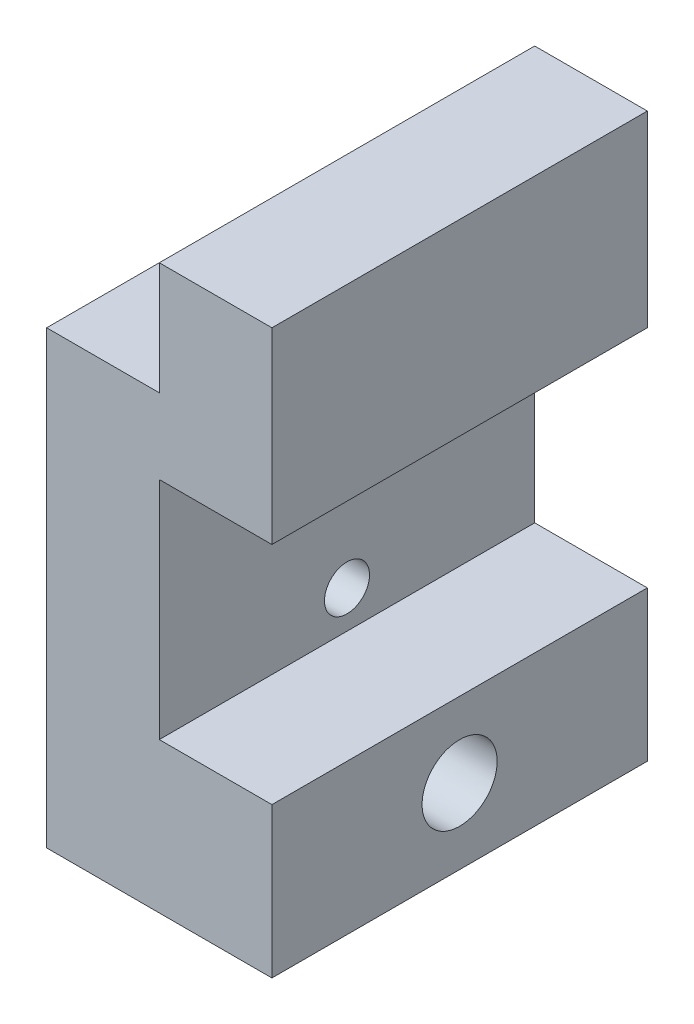
ISO-10303-21;
HEADER;
FILE_DESCRIPTION(('STEP AP214'),'2;1');
FILE_NAME('part.step','',(''),(''),'','','');
FILE_SCHEMA(('AUTOMOTIVE_DESIGN { 1 0 10303 214 1 1 1 1 }'));
ENDSEC;
DATA;
#1=APPLICATION_CONTEXT('core data for automotive mechanical design processes');
#2=APPLICATION_PROTOCOL_DEFINITION('international standard','automotive_design',2000,#1);
#3=PRODUCT_CONTEXT('',#1,'mechanical');
#4=PRODUCT('Part','Part','',(#3));
#5=PRODUCT_RELATED_PRODUCT_CATEGORY('part','',(#4));
#6=PRODUCT_DEFINITION_FORMATION('','',#4);
#7=PRODUCT_DEFINITION_CONTEXT('part definition',#1,'design');
#8=PRODUCT_DEFINITION('design','',#6,#7);
#9=PRODUCT_DEFINITION_SHAPE('','',#8);
#10=(LENGTH_UNIT() NAMED_UNIT(*) SI_UNIT(.MILLI.,.METRE.));
#11=(NAMED_UNIT(*) PLANE_ANGLE_UNIT() SI_UNIT($,.RADIAN.));
#12=(NAMED_UNIT(*) SI_UNIT($,.STERADIAN.) SOLID_ANGLE_UNIT());
#13=UNCERTAINTY_MEASURE_WITH_UNIT(LENGTH_MEASURE(1.E-05),#10,'distance_accuracy_value','');
#14=(GEOMETRIC_REPRESENTATION_CONTEXT(3) GLOBAL_UNCERTAINTY_ASSIGNED_CONTEXT((#13)) GLOBAL_UNIT_ASSIGNED_CONTEXT((#10,
#11,#12)) REPRESENTATION_CONTEXT('',''));
#15=CARTESIAN_POINT('',(0.,0.,0.));
#16=DIRECTION('',(0.,0.,1.));
#17=DIRECTION('',(1.,0.,0.));
#18=AXIS2_PLACEMENT_3D('',#15,#16,#17);
#19=CARTESIAN_POINT('',(30.,20.,-50.));
#20=DIRECTION('',(1.,0.,0.));
#21=DIRECTION('',(0.,0.,-1.));
#22=AXIS2_PLACEMENT_3D('',#19,#20,#21);
#23=PLANE('',#22);
#24=CARTESIAN_POINT('',(30.,10.,-25.));
#25=DIRECTION('',(1.,0.,0.));
#26=DIRECTION('',(0.,0.,-1.));
#27=AXIS2_PLACEMENT_3D('',#24,#25,#26);
#28=CIRCLE('',#27,5.);
#29=CARTESIAN_POINT('',(30.,10.,-30.));
#30=VERTEX_POINT('',#29);
#31=EDGE_CURVE('E192',#30,#30,#28,.T.);
#32=ORIENTED_EDGE('',*,*,#31,.F.);
#33=EDGE_LOOP('',(#32));
#34=FACE_BOUND('',#33,.T.);
#35=DIRECTION('',(0.,1.,0.));
#36=VECTOR('',#35,1.);
#37=CARTESIAN_POINT('',(30.,20.,0.));
#38=LINE('',#37,#36);
#39=CARTESIAN_POINT('',(30.,0.,0.));
#40=VERTEX_POINT('',#39);
#41=CARTESIAN_POINT('',(30.,20.,0.));
#42=VERTEX_POINT('',#41);
#43=EDGE_CURVE('E149',#40,#42,#38,.T.);
#44=ORIENTED_EDGE('',*,*,#43,.F.);
#45=DIRECTION('',(0.,0.,1.));
#46=VECTOR('',#45,1.);
#47=CARTESIAN_POINT('',(30.,0.,-50.));
#48=LINE('',#47,#46);
#49=CARTESIAN_POINT('',(30.,0.,-50.));
#50=VERTEX_POINT('',#49);
#51=EDGE_CURVE('E11',#50,#40,#48,.T.);
#52=ORIENTED_EDGE('',*,*,#51,.F.);
#53=DIRECTION('',(0.,1.,0.));
#54=VECTOR('',#53,1.);
#55=CARTESIAN_POINT('',(30.,20.,-50.));
#56=LINE('',#55,#54);
#57=CARTESIAN_POINT('',(30.,20.,-50.));
#58=VERTEX_POINT('',#57);
#59=EDGE_CURVE('E176',#50,#58,#56,.T.);
#60=ORIENTED_EDGE('',*,*,#59,.T.);
#61=DIRECTION('',(0.,0.,1.));
#62=VECTOR('',#61,1.);
#63=CARTESIAN_POINT('',(30.,20.,-50.));
#64=LINE('',#63,#62);
#65=EDGE_CURVE('E101',#58,#42,#64,.T.);
#66=ORIENTED_EDGE('',*,*,#65,.T.);
#67=EDGE_LOOP('',(#44,#52,#60,#66));
#68=FACE_BOUND('',#67,.T.);
#69=ADVANCED_FACE('F39',(#34,#68),#23,.T.);
#70=CARTESIAN_POINT('',(30.,0.,-50.));
#71=DIRECTION('',(0.,-1.,0.));
#72=DIRECTION('',(0.,0.,-1.));
#73=AXIS2_PLACEMENT_3D('',#70,#71,#72);
#74=PLANE('',#73);
#75=DIRECTION('',(1.,0.,0.));
#76=VECTOR('',#75,1.);
#77=CARTESIAN_POINT('',(30.,0.,0.));
#78=LINE('',#77,#76);
#79=CARTESIAN_POINT('',(0.,0.,0.));
#80=VERTEX_POINT('',#79);
#81=EDGE_CURVE('E174',#80,#40,#78,.T.);
#82=ORIENTED_EDGE('',*,*,#81,.F.);
#83=DIRECTION('',(0.,0.,1.));
#84=VECTOR('',#83,1.);
#85=CARTESIAN_POINT('',(0.,0.,-50.));
#86=LINE('',#85,#84);
#87=CARTESIAN_POINT('',(0.,0.,-50.));
#88=VERTEX_POINT('',#87);
#89=EDGE_CURVE('E48',#88,#80,#86,.T.);
#90=ORIENTED_EDGE('',*,*,#89,.F.);
#91=DIRECTION('',(1.,0.,0.));
#92=VECTOR('',#91,1.);
#93=CARTESIAN_POINT('',(30.,0.,-50.));
#94=LINE('',#93,#92);
#95=EDGE_CURVE('E139',#88,#50,#94,.T.);
#96=ORIENTED_EDGE('',*,*,#95,.T.);
#97=ORIENTED_EDGE('',*,*,#51,.T.);
#98=EDGE_LOOP('',(#82,#90,#96,#97));
#99=FACE_BOUND('',#98,.T.);
#100=ADVANCED_FACE('F236',(#99),#74,.T.);
#101=CARTESIAN_POINT('',(0.,0.,-50.));
#102=DIRECTION('',(-1.,0.,0.));
#103=DIRECTION('',(0.,0.,1.));
#104=AXIS2_PLACEMENT_3D('',#101,#102,#103);
#105=PLANE('',#104);
#106=CARTESIAN_POINT('',(0.,25.0000000000192,-25.));
#107=DIRECTION('',(-1.,0.,0.));
#108=DIRECTION('',(0.,0.,1.));
#109=AXIS2_PLACEMENT_3D('',#106,#107,#108);
#110=CIRCLE('',#109,3.);
#111=CARTESIAN_POINT('',(0.,25.0000000000192,-22.));
#112=VERTEX_POINT('',#111);
#113=EDGE_CURVE('E200',#112,#112,#110,.T.);
#114=ORIENTED_EDGE('',*,*,#113,.F.);
#115=EDGE_LOOP('',(#114));
#116=FACE_BOUND('',#115,.T.);
#117=CARTESIAN_POINT('',(0.,10.,-25.));
#118=DIRECTION('',(-1.,0.,0.));
#119=DIRECTION('',(0.,0.,1.));
#120=AXIS2_PLACEMENT_3D('',#117,#118,#119);
#121=CIRCLE('',#120,5.);
#122=CARTESIAN_POINT('',(0.,10.,-20.));
#123=VERTEX_POINT('',#122);
#124=EDGE_CURVE('E153',#123,#123,#121,.T.);
#125=ORIENTED_EDGE('',*,*,#124,.F.);
#126=EDGE_LOOP('',(#125));
#127=FACE_BOUND('',#126,.T.);
#128=DIRECTION('',(0.,-1.,0.));
#129=VECTOR('',#128,1.);
#130=CARTESIAN_POINT('',(0.,0.,0.));
#131=LINE('',#130,#129);
#132=CARTESIAN_POINT('',(0.,60.,0.));
#133=VERTEX_POINT('',#132);
#134=EDGE_CURVE('E126',#133,#80,#131,.T.);
#135=ORIENTED_EDGE('',*,*,#134,.F.);
#136=DIRECTION('',(0.,0.,1.));
#137=VECTOR('',#136,1.);
#138=CARTESIAN_POINT('',(0.,60.,-50.));
#139=LINE('',#138,#137);
#140=CARTESIAN_POINT('',(0.,60.,-50.));
#141=VERTEX_POINT('',#140);
#142=EDGE_CURVE('E121',#141,#133,#139,.T.);
#143=ORIENTED_EDGE('',*,*,#142,.F.);
#144=DIRECTION('',(0.,-1.,0.));
#145=VECTOR('',#144,1.);
#146=CARTESIAN_POINT('',(0.,0.,-50.));
#147=LINE('',#146,#145);
#148=EDGE_CURVE('E124',#141,#88,#147,.T.);
#149=ORIENTED_EDGE('',*,*,#148,.T.);
#150=ORIENTED_EDGE('',*,*,#89,.T.);
#151=EDGE_LOOP('',(#135,#143,#149,#150));
#152=FACE_BOUND('',#151,.T.);
#153=ADVANCED_FACE('F123',(#116,#127,#152),#105,.T.);
#154=CARTESIAN_POINT('',(0.,60.,-50.));
#155=DIRECTION('',(0.,1.,0.));
#156=DIRECTION('',(-1.,0.,0.));
#157=AXIS2_PLACEMENT_3D('',#154,#155,#156);
#158=PLANE('',#157);
#159=DIRECTION('',(-1.,0.,0.));
#160=VECTOR('',#159,1.);
#161=CARTESIAN_POINT('',(0.,60.,0.));
#162=LINE('',#161,#160);
#163=CARTESIAN_POINT('',(15.,60.,0.));
#164=VERTEX_POINT('',#163);
#165=EDGE_CURVE('E171',#164,#133,#162,.T.);
#166=ORIENTED_EDGE('',*,*,#165,.F.);
#167=DIRECTION('',(0.,0.,1.));
#168=VECTOR('',#167,1.);
#169=CARTESIAN_POINT('',(15.,60.,-50.));
#170=LINE('',#169,#168);
#171=CARTESIAN_POINT('',(15.,60.,-50.));
#172=VERTEX_POINT('',#171);
#173=EDGE_CURVE('E131',#172,#164,#170,.T.);
#174=ORIENTED_EDGE('',*,*,#173,.F.);
#175=DIRECTION('',(-1.,0.,0.));
#176=VECTOR('',#175,1.);
#177=CARTESIAN_POINT('',(0.,60.,-50.));
#178=LINE('',#177,#176);
#179=EDGE_CURVE('E137',#172,#141,#178,.T.);
#180=ORIENTED_EDGE('',*,*,#179,.T.);
#181=ORIENTED_EDGE('',*,*,#142,.T.);
#182=EDGE_LOOP('',(#166,#174,#180,#181));
#183=FACE_BOUND('',#182,.T.);
#184=ADVANCED_FACE('F141',(#183),#158,.T.);
#185=CARTESIAN_POINT('',(15.,75.,-50.));
#186=DIRECTION('',(-1.,0.,0.));
#187=DIRECTION('',(0.,-1.,0.));
#188=AXIS2_PLACEMENT_3D('',#185,#186,#187);
#189=PLANE('',#188);
#190=DIRECTION('',(0.,-1.,0.));
#191=VECTOR('',#190,1.);
#192=CARTESIAN_POINT('',(15.,75.,0.));
#193=LINE('',#192,#191);
#194=CARTESIAN_POINT('',(15.,75.,0.));
#195=VERTEX_POINT('',#194);
#196=EDGE_CURVE('E168',#195,#164,#193,.T.);
#197=ORIENTED_EDGE('',*,*,#196,.F.);
#198=DIRECTION('',(0.,0.,1.));
#199=VECTOR('',#198,1.);
#200=CARTESIAN_POINT('',(15.,75.,-50.));
#201=LINE('',#200,#199);
#202=CARTESIAN_POINT('',(15.,75.,-50.));
#203=VERTEX_POINT('',#202);
#204=EDGE_CURVE('E180',#203,#195,#201,.T.);
#205=ORIENTED_EDGE('',*,*,#204,.F.);
#206=DIRECTION('',(0.,-1.,0.));
#207=VECTOR('',#206,1.);
#208=CARTESIAN_POINT('',(15.,75.,-50.));
#209=LINE('',#208,#207);
#210=EDGE_CURVE('E142',#203,#172,#209,.T.);
#211=ORIENTED_EDGE('',*,*,#210,.T.);
#212=ORIENTED_EDGE('',*,*,#173,.T.);
#213=EDGE_LOOP('',(#197,#205,#211,#212));
#214=FACE_BOUND('',#213,.T.);
#215=ADVANCED_FACE('F223',(#214),#189,.T.);
#216=CARTESIAN_POINT('',(30.,75.,-50.));
#217=DIRECTION('',(0.,1.,0.));
#218=DIRECTION('',(0.,0.,1.));
#219=AXIS2_PLACEMENT_3D('',#216,#217,#218);
#220=PLANE('',#219);
#221=DIRECTION('',(-1.,0.,0.));
#222=VECTOR('',#221,1.);
#223=CARTESIAN_POINT('',(30.,75.,0.));
#224=LINE('',#223,#222);
#225=CARTESIAN_POINT('',(30.,75.,0.));
#226=VERTEX_POINT('',#225);
#227=EDGE_CURVE('E165',#226,#195,#224,.T.);
#228=ORIENTED_EDGE('',*,*,#227,.F.);
#229=DIRECTION('',(0.,0.,1.));
#230=VECTOR('',#229,1.);
#231=CARTESIAN_POINT('',(30.,75.,-50.));
#232=LINE('',#231,#230);
#233=CARTESIAN_POINT('',(30.,75.,-50.));
#234=VERTEX_POINT('',#233);
#235=EDGE_CURVE('E182',#234,#226,#232,.T.);
#236=ORIENTED_EDGE('',*,*,#235,.F.);
#237=DIRECTION('',(-1.,0.,0.));
#238=VECTOR('',#237,1.);
#239=CARTESIAN_POINT('',(30.,75.,-50.));
#240=LINE('',#239,#238);
#241=EDGE_CURVE('E144',#234,#203,#240,.T.);
#242=ORIENTED_EDGE('',*,*,#241,.T.);
#243=ORIENTED_EDGE('',*,*,#204,.T.);
#244=EDGE_LOOP('',(#228,#236,#242,#243));
#245=FACE_BOUND('',#244,.T.);
#246=ADVANCED_FACE('F218',(#245),#220,.T.);
#247=CARTESIAN_POINT('',(30.,60.,-50.));
#248=DIRECTION('',(1.,0.,0.));
#249=DIRECTION('',(0.,0.,-1.));
#250=AXIS2_PLACEMENT_3D('',#247,#248,#249);
#251=PLANE('',#250);
#252=DIRECTION('',(0.,1.,0.));
#253=VECTOR('',#252,1.);
#254=CARTESIAN_POINT('',(30.,60.,0.));
#255=LINE('',#254,#253);
#256=CARTESIAN_POINT('',(30.,50.,0.));
#257=VERTEX_POINT('',#256);
#258=EDGE_CURVE('E162',#257,#226,#255,.T.);
#259=ORIENTED_EDGE('',*,*,#258,.F.);
#260=DIRECTION('',(0.,0.,1.));
#261=VECTOR('',#260,1.);
#262=CARTESIAN_POINT('',(30.,50.,-50.));
#263=LINE('',#262,#261);
#264=CARTESIAN_POINT('',(30.,50.,-50.));
#265=VERTEX_POINT('',#264);
#266=EDGE_CURVE('E184',#265,#257,#263,.T.);
#267=ORIENTED_EDGE('',*,*,#266,.F.);
#268=DIRECTION('',(0.,1.,0.));
#269=VECTOR('',#268,1.);
#270=CARTESIAN_POINT('',(30.,60.,-50.));
#271=LINE('',#270,#269);
#272=EDGE_CURVE('E212',#265,#234,#271,.T.);
#273=ORIENTED_EDGE('',*,*,#272,.T.);
#274=ORIENTED_EDGE('',*,*,#235,.T.);
#275=EDGE_LOOP('',(#259,#267,#273,#274));
#276=FACE_BOUND('',#275,.T.);
#277=ADVANCED_FACE('F228',(#276),#251,.T.);
#278=CARTESIAN_POINT('',(30.,50.,-50.));
#279=DIRECTION('',(0.,-1.,0.));
#280=DIRECTION('',(0.,0.,-1.));
#281=AXIS2_PLACEMENT_3D('',#278,#279,#280);
#282=PLANE('',#281);
#283=DIRECTION('',(1.,0.,0.));
#284=VECTOR('',#283,1.);
#285=CARTESIAN_POINT('',(30.,50.,0.));
#286=LINE('',#285,#284);
#287=CARTESIAN_POINT('',(15.,50.,0.));
#288=VERTEX_POINT('',#287);
#289=EDGE_CURVE('E159',#288,#257,#286,.T.);
#290=ORIENTED_EDGE('',*,*,#289,.F.);
#291=DIRECTION('',(0.,0.,1.));
#292=VECTOR('',#291,1.);
#293=CARTESIAN_POINT('',(15.,50.,-50.));
#294=LINE('',#293,#292);
#295=CARTESIAN_POINT('',(15.,50.,-50.));
#296=VERTEX_POINT('',#295);
#297=EDGE_CURVE('E187',#296,#288,#294,.T.);
#298=ORIENTED_EDGE('',*,*,#297,.F.);
#299=DIRECTION('',(1.,0.,0.));
#300=VECTOR('',#299,1.);
#301=CARTESIAN_POINT('',(30.,50.,-50.));
#302=LINE('',#301,#300);
#303=EDGE_CURVE('E209',#296,#265,#302,.T.);
#304=ORIENTED_EDGE('',*,*,#303,.T.);
#305=ORIENTED_EDGE('',*,*,#266,.T.);
#306=EDGE_LOOP('',(#290,#298,#304,#305));
#307=FACE_BOUND('',#306,.T.);
#308=ADVANCED_FACE('F230',(#307),#282,.T.);
#309=CARTESIAN_POINT('',(15.,50.,-50.));
#310=DIRECTION('',(1.,0.,0.));
#311=DIRECTION('',(0.,1.,0.));
#312=AXIS2_PLACEMENT_3D('',#309,#310,#311);
#313=PLANE('',#312);
#314=CARTESIAN_POINT('',(15.,25.0000000000192,-25.));
#315=DIRECTION('',(1.,0.,0.));
#316=DIRECTION('',(0.,1.,0.));
#317=AXIS2_PLACEMENT_3D('',#314,#315,#316);
#318=CIRCLE('',#317,3.);
#319=CARTESIAN_POINT('',(15.,28.0000000000192,-25.));
#320=VERTEX_POINT('',#319);
#321=EDGE_CURVE('E42',#320,#320,#318,.T.);
#322=ORIENTED_EDGE('',*,*,#321,.F.);
#323=EDGE_LOOP('',(#322));
#324=FACE_BOUND('',#323,.T.);
#325=DIRECTION('',(0.,1.,0.));
#326=VECTOR('',#325,1.);
#327=CARTESIAN_POINT('',(15.,50.,0.));
#328=LINE('',#327,#326);
#329=CARTESIAN_POINT('',(15.,20.,0.));
#330=VERTEX_POINT('',#329);
#331=EDGE_CURVE('E156',#330,#288,#328,.T.);
#332=ORIENTED_EDGE('',*,*,#331,.F.);
#333=DIRECTION('',(0.,0.,1.));
#334=VECTOR('',#333,1.);
#335=CARTESIAN_POINT('',(15.,20.,-50.));
#336=LINE('',#335,#334);
#337=CARTESIAN_POINT('',(15.,20.,-50.));
#338=VERTEX_POINT('',#337);
#339=EDGE_CURVE('E189',#338,#330,#336,.T.);
#340=ORIENTED_EDGE('',*,*,#339,.F.);
#341=DIRECTION('',(0.,1.,0.));
#342=VECTOR('',#341,1.);
#343=CARTESIAN_POINT('',(15.,50.,-50.));
#344=LINE('',#343,#342);
#345=EDGE_CURVE('E206',#338,#296,#344,.T.);
#346=ORIENTED_EDGE('',*,*,#345,.T.);
#347=ORIENTED_EDGE('',*,*,#297,.T.);
#348=EDGE_LOOP('',(#332,#340,#346,#347));
#349=FACE_BOUND('',#348,.T.);
#350=ADVANCED_FACE('F234',(#324,#349),#313,.T.);
#351=CARTESIAN_POINT('',(15.,20.,-50.));
#352=DIRECTION('',(0.,1.,0.));
#353=DIRECTION('',(0.,0.,1.));
#354=AXIS2_PLACEMENT_3D('',#351,#352,#353);
#355=PLANE('',#354);
#356=DIRECTION('',(-1.,0.,0.));
#357=VECTOR('',#356,1.);
#358=CARTESIAN_POINT('',(15.,20.,0.));
#359=LINE('',#358,#357);
#360=EDGE_CURVE('E152',#42,#330,#359,.T.);
#361=ORIENTED_EDGE('',*,*,#360,.F.);
#362=ORIENTED_EDGE('',*,*,#65,.F.);
#363=DIRECTION('',(-1.,0.,0.));
#364=VECTOR('',#363,1.);
#365=CARTESIAN_POINT('',(15.,20.,-50.));
#366=LINE('',#365,#364);
#367=EDGE_CURVE('E204',#58,#338,#366,.T.);
#368=ORIENTED_EDGE('',*,*,#367,.T.);
#369=ORIENTED_EDGE('',*,*,#339,.T.);
#370=EDGE_LOOP('',(#361,#362,#368,#369));
#371=FACE_BOUND('',#370,.T.);
#372=ADVANCED_FACE('F235',(#371),#355,.T.);
#373=CARTESIAN_POINT('',(0.,0.,-50.));
#374=DIRECTION('',(0.,0.,-1.));
#375=DIRECTION('',(-1.,0.,0.));
#376=AXIS2_PLACEMENT_3D('',#373,#374,#375);
#377=PLANE('',#376);
#378=ORIENTED_EDGE('',*,*,#59,.F.);
#379=ORIENTED_EDGE('',*,*,#95,.F.);
#380=ORIENTED_EDGE('',*,*,#148,.F.);
#381=ORIENTED_EDGE('',*,*,#179,.F.);
#382=ORIENTED_EDGE('',*,*,#210,.F.);
#383=ORIENTED_EDGE('',*,*,#241,.F.);
#384=ORIENTED_EDGE('',*,*,#272,.F.);
#385=ORIENTED_EDGE('',*,*,#303,.F.);
#386=ORIENTED_EDGE('',*,*,#345,.F.);
#387=ORIENTED_EDGE('',*,*,#367,.F.);
#388=EDGE_LOOP('',(#378,#379,#380,#381,#382,#383,#384,#385,#386,#387));
#389=FACE_BOUND('',#388,.T.);
#390=ADVANCED_FACE('F135',(#389),#377,.T.);
#391=CARTESIAN_POINT('',(0.,0.,0.));
#392=DIRECTION('',(0.,0.,-1.));
#393=DIRECTION('',(-1.,0.,0.));
#394=AXIS2_PLACEMENT_3D('',#391,#392,#393);
#395=PLANE('',#394);
#396=ORIENTED_EDGE('',*,*,#43,.T.);
#397=ORIENTED_EDGE('',*,*,#360,.T.);
#398=ORIENTED_EDGE('',*,*,#331,.T.);
#399=ORIENTED_EDGE('',*,*,#289,.T.);
#400=ORIENTED_EDGE('',*,*,#258,.T.);
#401=ORIENTED_EDGE('',*,*,#227,.T.);
#402=ORIENTED_EDGE('',*,*,#196,.T.);
#403=ORIENTED_EDGE('',*,*,#165,.T.);
#404=ORIENTED_EDGE('',*,*,#134,.T.);
#405=ORIENTED_EDGE('',*,*,#81,.T.);
#406=EDGE_LOOP('',(#396,#397,#398,#399,#400,#401,#402,#403,#404,#405));
#407=FACE_BOUND('',#406,.T.);
#408=ADVANCED_FACE('F225',(#407),#395,.F.);
#409=CARTESIAN_POINT('',(-20.,10.,-25.));
#410=DIRECTION('',(1.,0.,0.));
#411=DIRECTION('',(0.,0.,-1.));
#412=AXIS2_PLACEMENT_3D('',#409,#410,#411);
#413=CYLINDRICAL_SURFACE('',#412,5.);
#414=ORIENTED_EDGE('',*,*,#124,.T.);
#415=EDGE_LOOP('',(#414));
#416=FACE_BOUND('',#415,.T.);
#417=ORIENTED_EDGE('',*,*,#31,.T.);
#418=EDGE_LOOP('',(#417));
#419=FACE_BOUND('',#418,.T.);
#420=ADVANCED_FACE('F268',(#416,#419),#413,.F.);
#421=CARTESIAN_POINT('',(101.,25.0000000000192,-25.));
#422=DIRECTION('',(-1.,0.,0.));
#423=DIRECTION('',(0.,0.,1.));
#424=AXIS2_PLACEMENT_3D('',#421,#422,#423);
#425=CYLINDRICAL_SURFACE('',#424,3.);
#426=ORIENTED_EDGE('',*,*,#321,.T.);
#427=EDGE_LOOP('',(#426));
#428=FACE_BOUND('',#427,.T.);
#429=ORIENTED_EDGE('',*,*,#113,.T.);
#430=EDGE_LOOP('',(#429));
#431=FACE_BOUND('',#430,.T.);
#432=ADVANCED_FACE('F272',(#428,#431),#425,.F.);
#433=CLOSED_SHELL('',(#69,#100,#153,#184,#215,#246,#277,#308,#350,#372,#390,#408,#420,#432));
#434=MANIFOLD_SOLID_BREP('B2',#433);
#435=ADVANCED_BREP_SHAPE_REPRESENTATION('',(#18,#434),#14);
#436=SHAPE_DEFINITION_REPRESENTATION(#9,#435);
ENDSEC;
END-ISO-10303-21;
